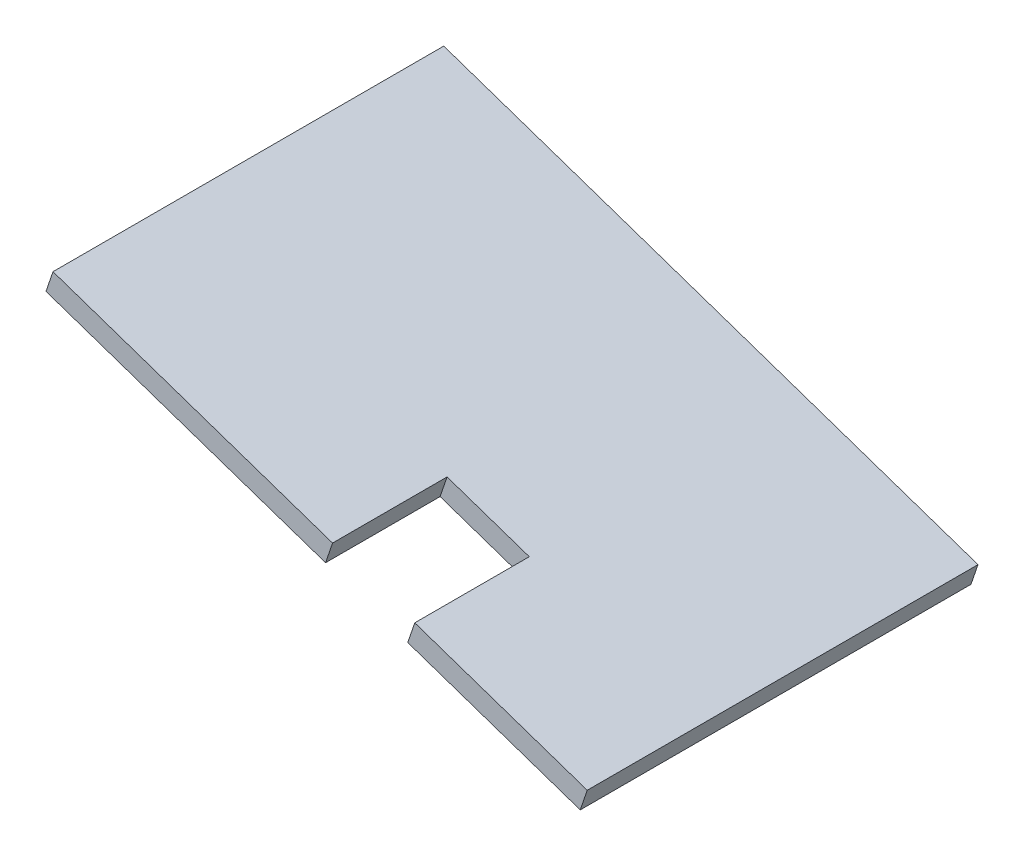
ISO-10303-21;
HEADER;
FILE_DESCRIPTION(('STEP AP214'),'2;1');
FILE_NAME('part.step','',(''),(''),'','','');
FILE_SCHEMA(('AUTOMOTIVE_DESIGN { 1 0 10303 214 1 1 1 1 }'));
ENDSEC;
DATA;
#1=APPLICATION_CONTEXT('core data for automotive mechanical design processes');
#2=APPLICATION_PROTOCOL_DEFINITION('international standard','automotive_design',2000,#1);
#3=PRODUCT_CONTEXT('',#1,'mechanical');
#4=PRODUCT('Part','Part','',(#3));
#5=PRODUCT_RELATED_PRODUCT_CATEGORY('part','',(#4));
#6=PRODUCT_DEFINITION_FORMATION('','',#4);
#7=PRODUCT_DEFINITION_CONTEXT('part definition',#1,'design');
#8=PRODUCT_DEFINITION('design','',#6,#7);
#9=PRODUCT_DEFINITION_SHAPE('','',#8);
#10=(LENGTH_UNIT() NAMED_UNIT(*) SI_UNIT(.MILLI.,.METRE.));
#11=(NAMED_UNIT(*) PLANE_ANGLE_UNIT() SI_UNIT($,.RADIAN.));
#12=(NAMED_UNIT(*) SI_UNIT($,.STERADIAN.) SOLID_ANGLE_UNIT());
#13=UNCERTAINTY_MEASURE_WITH_UNIT(LENGTH_MEASURE(1.E-05),#10,'distance_accuracy_value','');
#14=(GEOMETRIC_REPRESENTATION_CONTEXT(3) GLOBAL_UNCERTAINTY_ASSIGNED_CONTEXT((#13)) GLOBAL_UNIT_ASSIGNED_CONTEXT((#10,
#11,#12)) REPRESENTATION_CONTEXT('',''));
#15=CARTESIAN_POINT('',(0.,0.,0.));
#16=DIRECTION('',(0.,0.,1.));
#17=DIRECTION('',(1.,0.,0.));
#18=AXIS2_PLACEMENT_3D('',#15,#16,#17);
#19=CARTESIAN_POINT('',(579.761544930299,73.4170758234747,0.));
#20=DIRECTION('',(0.,0.,-1.));
#21=DIRECTION('',(-1.,0.,0.));
#22=AXIS2_PLACEMENT_3D('',#19,#20,#21);
#23=PLANE('',#22);
#24=DIRECTION('',(0.946603658931476,-0.322399616776356,0.));
#25=VECTOR('',#24,1.);
#26=CARTESIAN_POINT('',(579.761544930299,73.4170758234747,0.));
#27=LINE('',#26,#25);
#28=CARTESIAN_POINT('',(423.49063756221,126.640703445658,0.));
#29=VERTEX_POINT('',#28);
#30=CARTESIAN_POINT('',(505.266159530391,98.7891346338622,0.));
#31=VERTEX_POINT('',#30);
#32=EDGE_CURVE('E125',#29,#31,#27,.T.);
#33=ORIENTED_EDGE('',*,*,#32,.T.);
#34=DIRECTION('',(-0.322399616776356,-0.946603658931476,0.));
#35=VECTOR('',#34,1.);
#36=CARTESIAN_POINT('',(489.02271587051,51.0964501454798,0.));
#37=LINE('',#36,#35);
#38=CARTESIAN_POINT('',(507.313397096921,104.800067868077,0.));
#39=VERTEX_POINT('',#38);
#40=EDGE_CURVE('E110',#39,#31,#37,.T.);
#41=ORIENTED_EDGE('',*,*,#40,.F.);
#42=DIRECTION('',(-0.946603658931477,0.322399616776356,0.));
#43=VECTOR('',#42,1.);
#44=CARTESIAN_POINT('',(581.808782496829,79.4280090576896,0.));
#45=LINE('',#44,#43);
#46=CARTESIAN_POINT('',(425.53787512874,132.651636679873,0.));
#47=VERTEX_POINT('',#46);
#48=EDGE_CURVE('E122',#39,#47,#45,.T.);
#49=ORIENTED_EDGE('',*,*,#48,.T.);
#50=DIRECTION('',(-0.322399616776356,-0.946603658931476,0.));
#51=VECTOR('',#50,1.);
#52=CARTESIAN_POINT('',(425.53787512874,132.651636679873,0.));
#53=LINE('',#52,#51);
#54=EDGE_CURVE('E136',#47,#29,#53,.T.);
#55=ORIENTED_EDGE('',*,*,#54,.T.);
#56=EDGE_LOOP('',(#33,#41,#49,#55));
#57=FACE_BOUND('',#56,.T.);
#58=ADVANCED_FACE('F32',(#57),#23,.F.);
#59=CARTESIAN_POINT('',(581.808782496829,79.4280090576896,-114.3));
#60=DIRECTION('',(0.946603658931474,-0.322399616776364,0.));
#61=DIRECTION('',(0.322399616776364,0.946603658931474,0.));
#62=AXIS2_PLACEMENT_3D('',#59,#60,#61);
#63=PLANE('',#62);
#64=DIRECTION('',(0.322399616776364,0.946603658931474,0.));
#65=VECTOR('',#64,1.);
#66=CARTESIAN_POINT('',(581.808782496829,79.4280090576896,0.));
#67=LINE('',#66,#65);
#68=CARTESIAN_POINT('',(579.761544930299,73.4170758234747,0.));
#69=VERTEX_POINT('',#68);
#70=CARTESIAN_POINT('',(581.808782496829,79.4280090576896,0.));
#71=VERTEX_POINT('',#70);
#72=EDGE_CURVE('E133',#69,#71,#67,.T.);
#73=ORIENTED_EDGE('',*,*,#72,.F.);
#74=DIRECTION('',(0.,0.,1.));
#75=VECTOR('',#74,1.);
#76=CARTESIAN_POINT('',(579.761544930299,73.4170758234747,-114.3));
#77=LINE('',#76,#75);
#78=CARTESIAN_POINT('',(579.761544930299,73.4170758234747,-114.3));
#79=VERTEX_POINT('',#78);
#80=EDGE_CURVE('E11',#79,#69,#77,.T.);
#81=ORIENTED_EDGE('',*,*,#80,.F.);
#82=DIRECTION('',(0.322399616776364,0.946603658931474,0.));
#83=VECTOR('',#82,1.);
#84=CARTESIAN_POINT('',(581.808782496829,79.4280090576896,-114.3));
#85=LINE('',#84,#83);
#86=CARTESIAN_POINT('',(581.808782496829,79.4280090576896,-114.3));
#87=VERTEX_POINT('',#86);
#88=EDGE_CURVE('E141',#79,#87,#85,.T.);
#89=ORIENTED_EDGE('',*,*,#88,.T.);
#90=DIRECTION('',(0.,0.,1.));
#91=VECTOR('',#90,1.);
#92=CARTESIAN_POINT('',(581.808782496829,79.4280090576896,-114.3));
#93=LINE('',#92,#91);
#94=EDGE_CURVE('E36',#87,#71,#93,.T.);
#95=ORIENTED_EDGE('',*,*,#94,.T.);
#96=EDGE_LOOP('',(#73,#81,#89,#95));
#97=FACE_BOUND('',#96,.T.);
#98=ADVANCED_FACE('F34',(#97),#63,.T.);
#99=CARTESIAN_POINT('',(579.761544930299,73.4170758234747,-114.3));
#100=DIRECTION('',(-0.322399616776356,-0.946603658931476,0.));
#101=DIRECTION('',(0.946603658931476,-0.322399616776356,0.));
#102=AXIS2_PLACEMENT_3D('',#99,#100,#101);
#103=PLANE('',#102);
#104=DIRECTION('',(0.,0.,1.));
#105=VECTOR('',#104,1.);
#106=CARTESIAN_POINT('',(505.266159530391,98.7891346338622,-33.4984835007856));
#107=LINE('',#106,#105);
#108=CARTESIAN_POINT('',(505.266159530391,98.7891346338622,-33.4984835007856));
#109=VERTEX_POINT('',#108);
#110=EDGE_CURVE('E117',#109,#31,#107,.T.);
#111=ORIENTED_EDGE('',*,*,#110,.T.);
#112=ORIENTED_EDGE('',*,*,#32,.F.);
#113=DIRECTION('',(0.,0.,1.));
#114=VECTOR('',#113,1.);
#115=CARTESIAN_POINT('',(423.49063756221,126.640703445658,-114.3));
#116=LINE('',#115,#114);
#117=CARTESIAN_POINT('',(423.49063756221,126.640703445658,-114.3));
#118=VERTEX_POINT('',#117);
#119=EDGE_CURVE('E41',#118,#29,#116,.T.);
#120=ORIENTED_EDGE('',*,*,#119,.F.);
#121=DIRECTION('',(0.946603658931476,-0.322399616776356,0.));
#122=VECTOR('',#121,1.);
#123=CARTESIAN_POINT('',(579.761544930299,73.4170758234747,-114.3));
#124=LINE('',#123,#122);
#125=EDGE_CURVE('E143',#118,#79,#124,.T.);
#126=ORIENTED_EDGE('',*,*,#125,.T.);
#127=ORIENTED_EDGE('',*,*,#80,.T.);
#128=CARTESIAN_POINT('',(529.30989246725,90.6001843677428,0.));
#129=VERTEX_POINT('',#128);
#130=EDGE_CURVE('E78',#129,#69,#27,.T.);
#131=ORIENTED_EDGE('',*,*,#130,.F.);
#132=DIRECTION('',(0.,0.,-1.));
#133=VECTOR('',#132,1.);
#134=CARTESIAN_POINT('',(529.30989246725,90.6001843677428,-33.4984835007856));
#135=LINE('',#134,#133);
#136=CARTESIAN_POINT('',(529.30989246725,90.6001843677428,-33.4984835007856));
#137=VERTEX_POINT('',#136);
#138=EDGE_CURVE('E49',#129,#137,#135,.T.);
#139=ORIENTED_EDGE('',*,*,#138,.T.);
#140=DIRECTION('',(-0.946603658931476,0.322399616776356,0.));
#141=VECTOR('',#140,1.);
#142=CARTESIAN_POINT('',(505.266159530391,98.7891346338622,-33.4984835007856));
#143=LINE('',#142,#141);
#144=EDGE_CURVE('E126',#137,#109,#143,.T.);
#145=ORIENTED_EDGE('',*,*,#144,.T.);
#146=EDGE_LOOP('',(#111,#112,#120,#126,#127,#131,#139,#145));
#147=FACE_BOUND('',#146,.T.);
#148=ADVANCED_FACE('F169',(#147),#103,.T.);
#149=CARTESIAN_POINT('',(425.53787512874,132.651636679873,-114.3));
#150=DIRECTION('',(-0.946603658931476,0.322399616776356,0.));
#151=DIRECTION('',(-0.322399616776356,-0.946603658931476,0.));
#152=AXIS2_PLACEMENT_3D('',#149,#150,#151);
#153=PLANE('',#152);
#154=ORIENTED_EDGE('',*,*,#54,.F.);
#155=DIRECTION('',(0.,0.,1.));
#156=VECTOR('',#155,1.);
#157=CARTESIAN_POINT('',(425.53787512874,132.651636679873,-114.3));
#158=LINE('',#157,#156);
#159=CARTESIAN_POINT('',(425.53787512874,132.651636679873,-114.3));
#160=VERTEX_POINT('',#159);
#161=EDGE_CURVE('E130',#160,#47,#158,.T.);
#162=ORIENTED_EDGE('',*,*,#161,.F.);
#163=DIRECTION('',(-0.322399616776356,-0.946603658931476,0.));
#164=VECTOR('',#163,1.);
#165=CARTESIAN_POINT('',(425.53787512874,132.651636679873,-114.3));
#166=LINE('',#165,#164);
#167=EDGE_CURVE('E145',#160,#118,#166,.T.);
#168=ORIENTED_EDGE('',*,*,#167,.T.);
#169=ORIENTED_EDGE('',*,*,#119,.T.);
#170=EDGE_LOOP('',(#154,#162,#168,#169));
#171=FACE_BOUND('',#170,.T.);
#172=ADVANCED_FACE('F174',(#171),#153,.T.);
#173=CARTESIAN_POINT('',(581.808782496829,79.4280090576896,-114.3));
#174=DIRECTION('',(0.322399616776356,0.946603658931476,0.));
#175=DIRECTION('',(-0.946603658931477,0.322399616776356,0.));
#176=AXIS2_PLACEMENT_3D('',#173,#174,#175);
#177=PLANE('',#176);
#178=DIRECTION('',(0.,0.,1.));
#179=VECTOR('',#178,1.);
#180=CARTESIAN_POINT('',(507.313397096921,104.800067868077,-33.4984835007856));
#181=LINE('',#180,#179);
#182=CARTESIAN_POINT('',(507.313397096921,104.800067868077,-33.4984835007856));
#183=VERTEX_POINT('',#182);
#184=EDGE_CURVE('E106',#183,#39,#181,.T.);
#185=ORIENTED_EDGE('',*,*,#184,.F.);
#186=DIRECTION('',(-0.946603658931476,0.322399616776356,0.));
#187=VECTOR('',#186,1.);
#188=CARTESIAN_POINT('',(507.313397096921,104.800067868077,-33.4984835007856));
#189=LINE('',#188,#187);
#190=CARTESIAN_POINT('',(531.35713003378,96.6111176019578,-33.4984835007856));
#191=VERTEX_POINT('',#190);
#192=EDGE_CURVE('E157',#191,#183,#189,.T.);
#193=ORIENTED_EDGE('',*,*,#192,.F.);
#194=DIRECTION('',(0.,0.,-1.));
#195=VECTOR('',#194,1.);
#196=CARTESIAN_POINT('',(531.35713003378,96.6111176019578,-33.4984835007856));
#197=LINE('',#196,#195);
#198=CARTESIAN_POINT('',(531.35713003378,96.6111176019578,0.));
#199=VERTEX_POINT('',#198);
#200=EDGE_CURVE('E116',#199,#191,#197,.T.);
#201=ORIENTED_EDGE('',*,*,#200,.F.);
#202=EDGE_CURVE('E132',#71,#199,#45,.T.);
#203=ORIENTED_EDGE('',*,*,#202,.F.);
#204=ORIENTED_EDGE('',*,*,#94,.F.);
#205=DIRECTION('',(-0.946603658931477,0.322399616776356,0.));
#206=VECTOR('',#205,1.);
#207=CARTESIAN_POINT('',(581.808782496829,79.4280090576896,-114.3));
#208=LINE('',#207,#206);
#209=EDGE_CURVE('E149',#87,#160,#208,.T.);
#210=ORIENTED_EDGE('',*,*,#209,.T.);
#211=ORIENTED_EDGE('',*,*,#161,.T.);
#212=ORIENTED_EDGE('',*,*,#48,.F.);
#213=EDGE_LOOP('',(#185,#193,#201,#203,#204,#210,#211,#212));
#214=FACE_BOUND('',#213,.T.);
#215=ADVANCED_FACE('F129',(#214),#177,.T.);
#216=CARTESIAN_POINT('',(579.761544930299,73.4170758234747,-114.3));
#217=DIRECTION('',(0.,0.,-1.));
#218=DIRECTION('',(-1.,0.,0.));
#219=AXIS2_PLACEMENT_3D('',#216,#217,#218);
#220=PLANE('',#219);
#221=ORIENTED_EDGE('',*,*,#88,.F.);
#222=ORIENTED_EDGE('',*,*,#125,.F.);
#223=ORIENTED_EDGE('',*,*,#167,.F.);
#224=ORIENTED_EDGE('',*,*,#209,.F.);
#225=EDGE_LOOP('',(#221,#222,#223,#224));
#226=FACE_BOUND('',#225,.T.);
#227=ADVANCED_FACE('F181',(#226),#220,.T.);
#228=ORIENTED_EDGE('',*,*,#202,.T.);
#229=DIRECTION('',(0.322399616776356,0.946603658931476,0.));
#230=VECTOR('',#229,1.);
#231=CARTESIAN_POINT('',(513.06644880737,42.9074998793604,0.));
#232=LINE('',#231,#230);
#233=EDGE_CURVE('E127',#129,#199,#232,.T.);
#234=ORIENTED_EDGE('',*,*,#233,.F.);
#235=ORIENTED_EDGE('',*,*,#130,.T.);
#236=ORIENTED_EDGE('',*,*,#72,.T.);
#237=EDGE_LOOP('',(#228,#234,#235,#236));
#238=FACE_BOUND('',#237,.T.);
#239=ADVANCED_FACE('F167',(#238),#23,.F.);
#240=CARTESIAN_POINT('',(489.02271587051,51.0964501454798,-33.4984835007856));
#241=DIRECTION('',(-0.946603658931476,0.322399616776356,0.));
#242=DIRECTION('',(-0.322399616776356,-0.946603658931476,0.));
#243=AXIS2_PLACEMENT_3D('',#240,#241,#242);
#244=PLANE('',#243);
#245=DIRECTION('',(0.322399616776356,0.946603658931476,0.));
#246=VECTOR('',#245,1.);
#247=CARTESIAN_POINT('',(489.02271587051,51.0964501454798,-33.4984835007856));
#248=LINE('',#247,#246);
#249=EDGE_CURVE('E112',#109,#183,#248,.T.);
#250=ORIENTED_EDGE('',*,*,#249,.T.);
#251=ORIENTED_EDGE('',*,*,#184,.T.);
#252=ORIENTED_EDGE('',*,*,#40,.T.);
#253=ORIENTED_EDGE('',*,*,#110,.F.);
#254=EDGE_LOOP('',(#250,#251,#252,#253));
#255=FACE_BOUND('',#254,.T.);
#256=ADVANCED_FACE('F108',(#255),#244,.F.);
#257=CARTESIAN_POINT('',(489.02271587051,51.0964501454798,-33.4984835007856));
#258=DIRECTION('',(0.,0.,-1.));
#259=DIRECTION('',(-1.,0.,0.));
#260=AXIS2_PLACEMENT_3D('',#257,#258,#259);
#261=PLANE('',#260);
#262=DIRECTION('',(0.322399616776356,0.946603658931476,0.));
#263=VECTOR('',#262,1.);
#264=CARTESIAN_POINT('',(513.06644880737,42.9074998793604,-33.4984835007856));
#265=LINE('',#264,#263);
#266=EDGE_CURVE('E155',#137,#191,#265,.T.);
#267=ORIENTED_EDGE('',*,*,#266,.T.);
#268=ORIENTED_EDGE('',*,*,#192,.T.);
#269=ORIENTED_EDGE('',*,*,#249,.F.);
#270=ORIENTED_EDGE('',*,*,#144,.F.);
#271=EDGE_LOOP('',(#267,#268,#269,#270));
#272=FACE_BOUND('',#271,.T.);
#273=ADVANCED_FACE('F186',(#272),#261,.F.);
#274=CARTESIAN_POINT('',(513.06644880737,42.9074998793604,-33.4984835007856));
#275=DIRECTION('',(0.946603658931476,-0.322399616776356,0.));
#276=DIRECTION('',(0.322399616776356,0.946603658931476,0.));
#277=AXIS2_PLACEMENT_3D('',#274,#275,#276);
#278=PLANE('',#277);
#279=ORIENTED_EDGE('',*,*,#233,.T.);
#280=ORIENTED_EDGE('',*,*,#200,.T.);
#281=ORIENTED_EDGE('',*,*,#266,.F.);
#282=ORIENTED_EDGE('',*,*,#138,.F.);
#283=EDGE_LOOP('',(#279,#280,#281,#282));
#284=FACE_BOUND('',#283,.T.);
#285=ADVANCED_FACE('F166',(#284),#278,.F.);
#286=CLOSED_SHELL('',(#58,#98,#148,#172,#215,#227,#239,#256,#273,#285));
#287=MANIFOLD_SOLID_BREP('B2',#286);
#288=ADVANCED_BREP_SHAPE_REPRESENTATION('',(#18,#287),#14);
#289=SHAPE_DEFINITION_REPRESENTATION(#9,#288);
ENDSEC;
END-ISO-10303-21;
